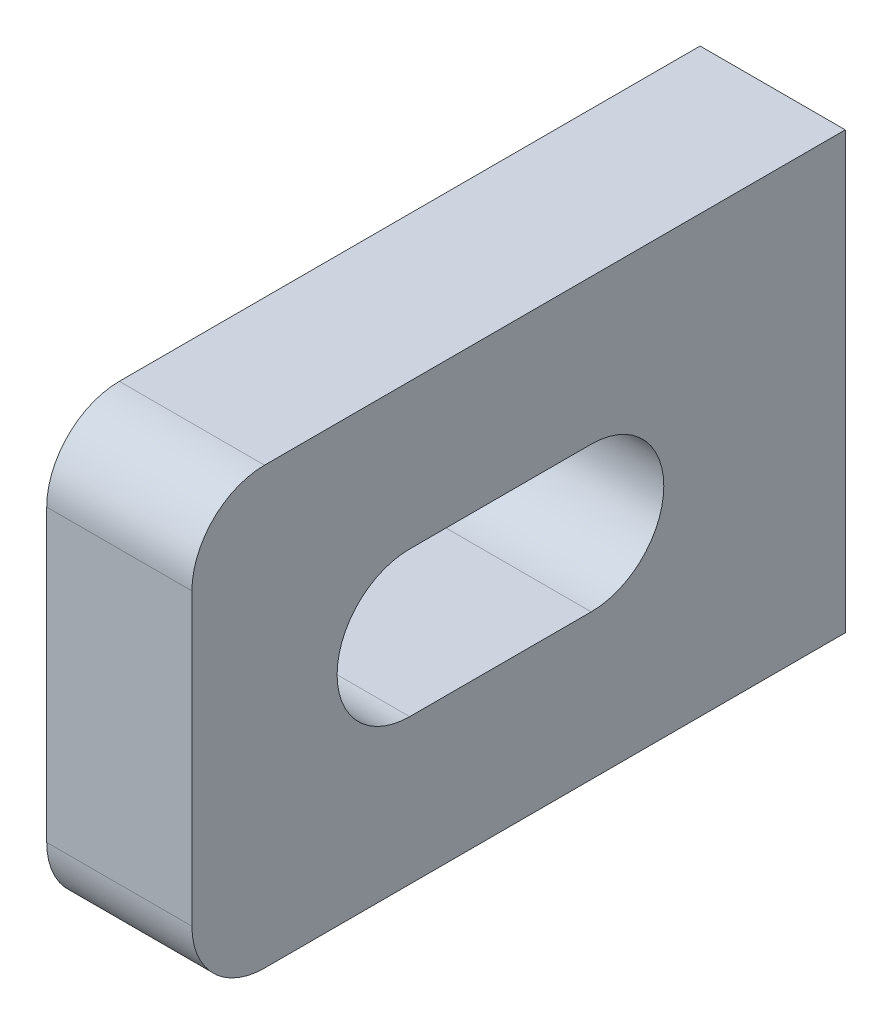
ISO-10303-21;
HEADER;
FILE_DESCRIPTION(('STEP AP214'),'2;1');
FILE_NAME('part.step','',(''),(''),'','','');
FILE_SCHEMA(('AUTOMOTIVE_DESIGN { 1 0 10303 214 1 1 1 1 }'));
ENDSEC;
DATA;
#1=APPLICATION_CONTEXT('core data for automotive mechanical design processes');
#2=APPLICATION_PROTOCOL_DEFINITION('international standard','automotive_design',2000,#1);
#3=PRODUCT_CONTEXT('',#1,'mechanical');
#4=PRODUCT('Part','Part','',(#3));
#5=PRODUCT_RELATED_PRODUCT_CATEGORY('part','',(#4));
#6=PRODUCT_DEFINITION_FORMATION('','',#4);
#7=PRODUCT_DEFINITION_CONTEXT('part definition',#1,'design');
#8=PRODUCT_DEFINITION('design','',#6,#7);
#9=PRODUCT_DEFINITION_SHAPE('','',#8);
#10=(LENGTH_UNIT() NAMED_UNIT(*) SI_UNIT(.MILLI.,.METRE.));
#11=(NAMED_UNIT(*) PLANE_ANGLE_UNIT() SI_UNIT($,.RADIAN.));
#12=(NAMED_UNIT(*) SI_UNIT($,.STERADIAN.) SOLID_ANGLE_UNIT());
#13=UNCERTAINTY_MEASURE_WITH_UNIT(LENGTH_MEASURE(1.E-05),#10,'distance_accuracy_value','');
#14=(GEOMETRIC_REPRESENTATION_CONTEXT(3) GLOBAL_UNCERTAINTY_ASSIGNED_CONTEXT((#13)) GLOBAL_UNIT_ASSIGNED_CONTEXT((#10,
#11,#12)) REPRESENTATION_CONTEXT('',''));
#15=CARTESIAN_POINT('',(0.,0.,0.));
#16=DIRECTION('',(0.,0.,1.));
#17=DIRECTION('',(1.,0.,0.));
#18=AXIS2_PLACEMENT_3D('',#15,#16,#17);
#19=CARTESIAN_POINT('',(20.,60.,-90.));
#20=DIRECTION('',(0.,0.,1.));
#21=DIRECTION('',(0.,-1.,0.));
#22=AXIS2_PLACEMENT_3D('',#19,#20,#21);
#23=PLANE('',#22);
#24=DIRECTION('',(0.,1.,0.));
#25=VECTOR('',#24,1.);
#26=CARTESIAN_POINT('',(-20.,60.,-90.));
#27=LINE('',#26,#25);
#28=CARTESIAN_POINT('',(-20.,-60.,-90.));
#29=VERTEX_POINT('',#28);
#30=CARTESIAN_POINT('',(-20.,60.,-90.));
#31=VERTEX_POINT('',#30);
#32=EDGE_CURVE('E117',#29,#31,#27,.T.);
#33=ORIENTED_EDGE('',*,*,#32,.T.);
#34=DIRECTION('',(-1.,0.,0.));
#35=VECTOR('',#34,1.);
#36=CARTESIAN_POINT('',(20.,60.,-90.));
#37=LINE('',#36,#35);
#38=CARTESIAN_POINT('',(20.,60.,-90.));
#39=VERTEX_POINT('',#38);
#40=EDGE_CURVE('E180',#39,#31,#37,.T.);
#41=ORIENTED_EDGE('',*,*,#40,.F.);
#42=DIRECTION('',(0.,1.,0.));
#43=VECTOR('',#42,1.);
#44=CARTESIAN_POINT('',(20.,60.,-90.));
#45=LINE('',#44,#43);
#46=CARTESIAN_POINT('',(20.,-60.,-90.));
#47=VERTEX_POINT('',#46);
#48=EDGE_CURVE('E151',#47,#39,#45,.T.);
#49=ORIENTED_EDGE('',*,*,#48,.F.);
#50=DIRECTION('',(-1.,0.,0.));
#51=VECTOR('',#50,1.);
#52=CARTESIAN_POINT('',(20.,-60.,-90.));
#53=LINE('',#52,#51);
#54=EDGE_CURVE('E165',#47,#29,#53,.T.);
#55=ORIENTED_EDGE('',*,*,#54,.T.);
#56=EDGE_LOOP('',(#33,#41,#49,#55));
#57=FACE_BOUND('',#56,.T.);
#58=ADVANCED_FACE('F17',(#57),#23,.F.);
#59=CARTESIAN_POINT('',(20.,60.,90.));
#60=DIRECTION('',(0.,-1.,0.));
#61=DIRECTION('',(0.,0.,-1.));
#62=AXIS2_PLACEMENT_3D('',#59,#60,#61);
#63=PLANE('',#62);
#64=DIRECTION('',(0.,0.,1.));
#65=VECTOR('',#64,1.);
#66=CARTESIAN_POINT('',(-20.,60.,90.));
#67=LINE('',#66,#65);
#68=CARTESIAN_POINT('',(-20.,60.,70.));
#69=VERTEX_POINT('',#68);
#70=EDGE_CURVE('E169',#31,#69,#67,.T.);
#71=ORIENTED_EDGE('',*,*,#70,.T.);
#72=DIRECTION('',(-1.,0.,0.));
#73=VECTOR('',#72,1.);
#74=CARTESIAN_POINT('',(20.,60.,70.));
#75=LINE('',#74,#73);
#76=CARTESIAN_POINT('',(20.,60.,70.));
#77=VERTEX_POINT('',#76);
#78=EDGE_CURVE('E11',#69,#77,#75,.F.);
#79=ORIENTED_EDGE('',*,*,#78,.T.);
#80=DIRECTION('',(0.,0.,1.));
#81=VECTOR('',#80,1.);
#82=CARTESIAN_POINT('',(20.,60.,90.));
#83=LINE('',#82,#81);
#84=EDGE_CURVE('E155',#39,#77,#83,.T.);
#85=ORIENTED_EDGE('',*,*,#84,.F.);
#86=ORIENTED_EDGE('',*,*,#40,.T.);
#87=EDGE_LOOP('',(#71,#79,#85,#86));
#88=FACE_BOUND('',#87,.T.);
#89=ADVANCED_FACE('F217',(#88),#63,.F.);
#90=CARTESIAN_POINT('',(20.,60.,90.));
#91=DIRECTION('',(0.,0.,-1.));
#92=DIRECTION('',(0.,1.,0.));
#93=AXIS2_PLACEMENT_3D('',#90,#91,#92);
#94=PLANE('',#93);
#95=DIRECTION('',(0.,-1.,0.));
#96=VECTOR('',#95,1.);
#97=CARTESIAN_POINT('',(-20.,60.,90.));
#98=LINE('',#97,#96);
#99=CARTESIAN_POINT('',(-20.,40.,90.));
#100=VERTEX_POINT('',#99);
#101=CARTESIAN_POINT('',(-20.,-40.,90.));
#102=VERTEX_POINT('',#101);
#103=EDGE_CURVE('E172',#100,#102,#98,.T.);
#104=ORIENTED_EDGE('',*,*,#103,.T.);
#105=DIRECTION('',(-1.,0.,0.));
#106=VECTOR('',#105,1.);
#107=CARTESIAN_POINT('',(20.,-40.,90.));
#108=LINE('',#107,#106);
#109=CARTESIAN_POINT('',(20.,-40.,90.));
#110=VERTEX_POINT('',#109);
#111=EDGE_CURVE('E39',#102,#110,#108,.F.);
#112=ORIENTED_EDGE('',*,*,#111,.T.);
#113=DIRECTION('',(0.,-1.,0.));
#114=VECTOR('',#113,1.);
#115=CARTESIAN_POINT('',(20.,60.,90.));
#116=LINE('',#115,#114);
#117=CARTESIAN_POINT('',(20.,40.,90.));
#118=VERTEX_POINT('',#117);
#119=EDGE_CURVE('E159',#118,#110,#116,.T.);
#120=ORIENTED_EDGE('',*,*,#119,.F.);
#121=DIRECTION('',(-1.,0.,0.));
#122=VECTOR('',#121,1.);
#123=CARTESIAN_POINT('',(20.,40.,90.));
#124=LINE('',#123,#122);
#125=EDGE_CURVE('E192',#118,#100,#124,.T.);
#126=ORIENTED_EDGE('',*,*,#125,.T.);
#127=EDGE_LOOP('',(#104,#112,#120,#126));
#128=FACE_BOUND('',#127,.T.);
#129=ADVANCED_FACE('F213',(#128),#94,.F.);
#130=CARTESIAN_POINT('',(20.,-60.,90.));
#131=DIRECTION('',(0.,1.,0.));
#132=DIRECTION('',(0.,0.,1.));
#133=AXIS2_PLACEMENT_3D('',#130,#131,#132);
#134=PLANE('',#133);
#135=DIRECTION('',(0.,0.,-1.));
#136=VECTOR('',#135,1.);
#137=CARTESIAN_POINT('',(20.,-60.,90.));
#138=LINE('',#137,#136);
#139=CARTESIAN_POINT('',(20.,-60.,70.));
#140=VERTEX_POINT('',#139);
#141=EDGE_CURVE('E162',#140,#47,#138,.T.);
#142=ORIENTED_EDGE('',*,*,#141,.F.);
#143=DIRECTION('',(-1.,0.,0.));
#144=VECTOR('',#143,1.);
#145=CARTESIAN_POINT('',(20.,-60.,70.));
#146=LINE('',#145,#144);
#147=CARTESIAN_POINT('',(-20.,-60.,70.));
#148=VERTEX_POINT('',#147);
#149=EDGE_CURVE('E183',#140,#148,#146,.T.);
#150=ORIENTED_EDGE('',*,*,#149,.T.);
#151=DIRECTION('',(0.,0.,-1.));
#152=VECTOR('',#151,1.);
#153=CARTESIAN_POINT('',(-20.,-60.,90.));
#154=LINE('',#153,#152);
#155=EDGE_CURVE('E156',#148,#29,#154,.T.);
#156=ORIENTED_EDGE('',*,*,#155,.T.);
#157=ORIENTED_EDGE('',*,*,#54,.F.);
#158=EDGE_LOOP('',(#142,#150,#156,#157));
#159=FACE_BOUND('',#158,.T.);
#160=ADVANCED_FACE('F207',(#159),#134,.F.);
#161=CARTESIAN_POINT('',(20.,0.,0.));
#162=DIRECTION('',(1.,0.,0.));
#163=DIRECTION('',(0.,0.,-1.));
#164=AXIS2_PLACEMENT_3D('',#161,#162,#163);
#165=PLANE('',#164);
#166=CARTESIAN_POINT('',(20.,0.,30.));
#167=DIRECTION('',(1.,0.,0.));
#168=DIRECTION('',(0.,0.,-1.));
#169=AXIS2_PLACEMENT_3D('',#166,#167,#168);
#170=CIRCLE('',#169,20.);
#171=CARTESIAN_POINT('',(20.,20.,30.));
#172=VERTEX_POINT('',#171);
#173=CARTESIAN_POINT('',(20.,-20.,30.));
#174=VERTEX_POINT('',#173);
#175=EDGE_CURVE('E103',#172,#174,#170,.T.);
#176=ORIENTED_EDGE('',*,*,#175,.F.);
#177=DIRECTION('',(0.,0.,1.));
#178=VECTOR('',#177,1.);
#179=CARTESIAN_POINT('',(20.,20.,30.));
#180=LINE('',#179,#178);
#181=CARTESIAN_POINT('',(20.,20.,-20.));
#182=VERTEX_POINT('',#181);
#183=EDGE_CURVE('E108',#182,#172,#180,.T.);
#184=ORIENTED_EDGE('',*,*,#183,.F.);
#185=CARTESIAN_POINT('',(20.,0.,-20.));
#186=DIRECTION('',(1.,0.,0.));
#187=DIRECTION('',(0.,0.,-1.));
#188=AXIS2_PLACEMENT_3D('',#185,#186,#187);
#189=CIRCLE('',#188,20.);
#190=CARTESIAN_POINT('',(20.,-20.,-20.));
#191=VERTEX_POINT('',#190);
#192=EDGE_CURVE('E137',#191,#182,#189,.T.);
#193=ORIENTED_EDGE('',*,*,#192,.F.);
#194=DIRECTION('',(0.,0.,-1.));
#195=VECTOR('',#194,1.);
#196=CARTESIAN_POINT('',(20.,-20.,30.));
#197=LINE('',#196,#195);
#198=EDGE_CURVE('E129',#174,#191,#197,.T.);
#199=ORIENTED_EDGE('',*,*,#198,.F.);
#200=EDGE_LOOP('',(#176,#184,#193,#199));
#201=FACE_BOUND('',#200,.T.);
#202=ORIENTED_EDGE('',*,*,#119,.T.);
#203=CARTESIAN_POINT('',(20.,-40.,70.));
#204=DIRECTION('',(1.,0.,0.));
#205=DIRECTION('',(0.,0.,-1.));
#206=AXIS2_PLACEMENT_3D('',#203,#204,#205);
#207=CIRCLE('',#206,20.);
#208=EDGE_CURVE('E26',#110,#140,#207,.T.);
#209=ORIENTED_EDGE('',*,*,#208,.T.);
#210=ORIENTED_EDGE('',*,*,#141,.T.);
#211=ORIENTED_EDGE('',*,*,#48,.T.);
#212=ORIENTED_EDGE('',*,*,#84,.T.);
#213=CARTESIAN_POINT('',(20.,40.,70.));
#214=DIRECTION('',(1.,0.,0.));
#215=DIRECTION('',(0.,0.,-1.));
#216=AXIS2_PLACEMENT_3D('',#213,#214,#215);
#217=CIRCLE('',#216,20.);
#218=EDGE_CURVE('E197',#77,#118,#217,.T.);
#219=ORIENTED_EDGE('',*,*,#218,.T.);
#220=EDGE_LOOP('',(#202,#209,#210,#211,#212,#219));
#221=FACE_BOUND('',#220,.T.);
#222=ADVANCED_FACE('F202',(#201,#221),#165,.T.);
#223=CARTESIAN_POINT('',(-20.,0.,0.));
#224=DIRECTION('',(1.,0.,0.));
#225=DIRECTION('',(0.,0.,-1.));
#226=AXIS2_PLACEMENT_3D('',#223,#224,#225);
#227=PLANE('',#226);
#228=DIRECTION('',(0.,0.,-1.));
#229=VECTOR('',#228,1.);
#230=CARTESIAN_POINT('',(-20.,20.,30.));
#231=LINE('',#230,#229);
#232=CARTESIAN_POINT('',(-20.,20.,30.));
#233=VERTEX_POINT('',#232);
#234=CARTESIAN_POINT('',(-20.,20.,-20.));
#235=VERTEX_POINT('',#234);
#236=EDGE_CURVE('E123',#233,#235,#231,.T.);
#237=ORIENTED_EDGE('',*,*,#236,.F.);
#238=CARTESIAN_POINT('',(-20.,0.,30.));
#239=DIRECTION('',(1.,0.,0.));
#240=DIRECTION('',(0.,0.,-1.));
#241=AXIS2_PLACEMENT_3D('',#238,#239,#240);
#242=CIRCLE('',#241,20.);
#243=CARTESIAN_POINT('',(-20.,-20.,30.));
#244=VERTEX_POINT('',#243);
#245=EDGE_CURVE('E100',#244,#233,#242,.F.);
#246=ORIENTED_EDGE('',*,*,#245,.F.);
#247=DIRECTION('',(0.,0.,1.));
#248=VECTOR('',#247,1.);
#249=CARTESIAN_POINT('',(-20.,-20.,30.));
#250=LINE('',#249,#248);
#251=CARTESIAN_POINT('',(-20.,-20.,-20.));
#252=VERTEX_POINT('',#251);
#253=EDGE_CURVE('E112',#252,#244,#250,.T.);
#254=ORIENTED_EDGE('',*,*,#253,.F.);
#255=CARTESIAN_POINT('',(-20.,0.,-20.));
#256=DIRECTION('',(1.,0.,0.));
#257=DIRECTION('',(0.,0.,-1.));
#258=AXIS2_PLACEMENT_3D('',#255,#256,#257);
#259=CIRCLE('',#258,20.);
#260=EDGE_CURVE('E131',#235,#252,#259,.F.);
#261=ORIENTED_EDGE('',*,*,#260,.F.);
#262=EDGE_LOOP('',(#237,#246,#254,#261));
#263=FACE_BOUND('',#262,.T.);
#264=ORIENTED_EDGE('',*,*,#155,.F.);
#265=CARTESIAN_POINT('',(-20.,-40.,70.));
#266=DIRECTION('',(1.,0.,0.));
#267=DIRECTION('',(0.,0.,-1.));
#268=AXIS2_PLACEMENT_3D('',#265,#266,#267);
#269=CIRCLE('',#268,20.);
#270=EDGE_CURVE('E189',#148,#102,#269,.F.);
#271=ORIENTED_EDGE('',*,*,#270,.T.);
#272=ORIENTED_EDGE('',*,*,#103,.F.);
#273=CARTESIAN_POINT('',(-20.,40.,70.));
#274=DIRECTION('',(1.,0.,0.));
#275=DIRECTION('',(0.,0.,-1.));
#276=AXIS2_PLACEMENT_3D('',#273,#274,#275);
#277=CIRCLE('',#276,20.);
#278=EDGE_CURVE('E187',#100,#69,#277,.F.);
#279=ORIENTED_EDGE('',*,*,#278,.T.);
#280=ORIENTED_EDGE('',*,*,#70,.F.);
#281=ORIENTED_EDGE('',*,*,#32,.F.);
#282=EDGE_LOOP('',(#264,#271,#272,#279,#280,#281));
#283=FACE_BOUND('',#282,.T.);
#284=ADVANCED_FACE('F120',(#263,#283),#227,.F.);
#285=CARTESIAN_POINT('',(-20.001,0.,30.));
#286=DIRECTION('',(1.,0.,0.));
#287=DIRECTION('',(0.,0.,-1.));
#288=AXIS2_PLACEMENT_3D('',#285,#286,#287);
#289=CYLINDRICAL_SURFACE('',#288,20.);
#290=ORIENTED_EDGE('',*,*,#245,.T.);
#291=DIRECTION('',(1.,0.,0.));
#292=VECTOR('',#291,1.);
#293=CARTESIAN_POINT('',(-20.001,20.,30.));
#294=LINE('',#293,#292);
#295=EDGE_CURVE('E118',#233,#172,#294,.T.);
#296=ORIENTED_EDGE('',*,*,#295,.T.);
#297=ORIENTED_EDGE('',*,*,#175,.T.);
#298=DIRECTION('',(1.,0.,0.));
#299=VECTOR('',#298,1.);
#300=CARTESIAN_POINT('',(-20.001,-20.,30.));
#301=LINE('',#300,#299);
#302=EDGE_CURVE('E96',#244,#174,#301,.T.);
#303=ORIENTED_EDGE('',*,*,#302,.F.);
#304=EDGE_LOOP('',(#290,#296,#297,#303));
#305=FACE_BOUND('',#304,.T.);
#306=ADVANCED_FACE('F98',(#305),#289,.F.);
#307=CARTESIAN_POINT('',(-20.001,20.,30.));
#308=DIRECTION('',(0.,1.,0.));
#309=DIRECTION('',(0.,0.,1.));
#310=AXIS2_PLACEMENT_3D('',#307,#308,#309);
#311=PLANE('',#310);
#312=ORIENTED_EDGE('',*,*,#236,.T.);
#313=DIRECTION('',(1.,0.,0.));
#314=VECTOR('',#313,1.);
#315=CARTESIAN_POINT('',(-20.001,20.,-20.));
#316=LINE('',#315,#314);
#317=EDGE_CURVE('E146',#235,#182,#316,.T.);
#318=ORIENTED_EDGE('',*,*,#317,.T.);
#319=ORIENTED_EDGE('',*,*,#183,.T.);
#320=ORIENTED_EDGE('',*,*,#295,.F.);
#321=EDGE_LOOP('',(#312,#318,#319,#320));
#322=FACE_BOUND('',#321,.T.);
#323=ADVANCED_FACE('F241',(#322),#311,.F.);
#324=CARTESIAN_POINT('',(-20.001,0.,-20.));
#325=DIRECTION('',(1.,0.,0.));
#326=DIRECTION('',(0.,0.,-1.));
#327=AXIS2_PLACEMENT_3D('',#324,#325,#326);
#328=CYLINDRICAL_SURFACE('',#327,20.);
#329=ORIENTED_EDGE('',*,*,#260,.T.);
#330=DIRECTION('',(1.,0.,0.));
#331=VECTOR('',#330,1.);
#332=CARTESIAN_POINT('',(-20.001,-20.,-20.));
#333=LINE('',#332,#331);
#334=EDGE_CURVE('E107',#252,#191,#333,.T.);
#335=ORIENTED_EDGE('',*,*,#334,.T.);
#336=ORIENTED_EDGE('',*,*,#192,.T.);
#337=ORIENTED_EDGE('',*,*,#317,.F.);
#338=EDGE_LOOP('',(#329,#335,#336,#337));
#339=FACE_BOUND('',#338,.T.);
#340=ADVANCED_FACE('F235',(#339),#328,.F.);
#341=CARTESIAN_POINT('',(-20.001,-20.,30.));
#342=DIRECTION('',(0.,-1.,0.));
#343=DIRECTION('',(0.,0.,-1.));
#344=AXIS2_PLACEMENT_3D('',#341,#342,#343);
#345=PLANE('',#344);
#346=ORIENTED_EDGE('',*,*,#253,.T.);
#347=ORIENTED_EDGE('',*,*,#302,.T.);
#348=ORIENTED_EDGE('',*,*,#198,.T.);
#349=ORIENTED_EDGE('',*,*,#334,.F.);
#350=EDGE_LOOP('',(#346,#347,#348,#349));
#351=FACE_BOUND('',#350,.T.);
#352=ADVANCED_FACE('F113',(#351),#345,.F.);
#353=CARTESIAN_POINT('',(20.,-40.,70.));
#354=DIRECTION('',(-1.,0.,0.));
#355=DIRECTION('',(0.,0.,1.));
#356=AXIS2_PLACEMENT_3D('',#353,#354,#355);
#357=CYLINDRICAL_SURFACE('',#356,20.);
#358=ORIENTED_EDGE('',*,*,#208,.F.);
#359=ORIENTED_EDGE('',*,*,#111,.F.);
#360=ORIENTED_EDGE('',*,*,#270,.F.);
#361=ORIENTED_EDGE('',*,*,#149,.F.);
#362=EDGE_LOOP('',(#358,#359,#360,#361));
#363=FACE_BOUND('',#362,.T.);
#364=ADVANCED_FACE('F210',(#363),#357,.T.);
#365=CARTESIAN_POINT('',(20.,40.,70.));
#366=DIRECTION('',(-1.,0.,0.));
#367=DIRECTION('',(0.,0.,1.));
#368=AXIS2_PLACEMENT_3D('',#365,#366,#367);
#369=CYLINDRICAL_SURFACE('',#368,20.);
#370=ORIENTED_EDGE('',*,*,#218,.F.);
#371=ORIENTED_EDGE('',*,*,#78,.F.);
#372=ORIENTED_EDGE('',*,*,#278,.F.);
#373=ORIENTED_EDGE('',*,*,#125,.F.);
#374=EDGE_LOOP('',(#370,#371,#372,#373));
#375=FACE_BOUND('',#374,.T.);
#376=ADVANCED_FACE('F19',(#375),#369,.T.);
#377=CLOSED_SHELL('',(#58,#89,#129,#160,#222,#284,#306,#323,#340,#352,#364,#376));
#378=MANIFOLD_SOLID_BREP('B1',#377);
#379=ADVANCED_BREP_SHAPE_REPRESENTATION('',(#18,#378),#14);
#380=SHAPE_DEFINITION_REPRESENTATION(#9,#379);
ENDSEC;
END-ISO-10303-21;
